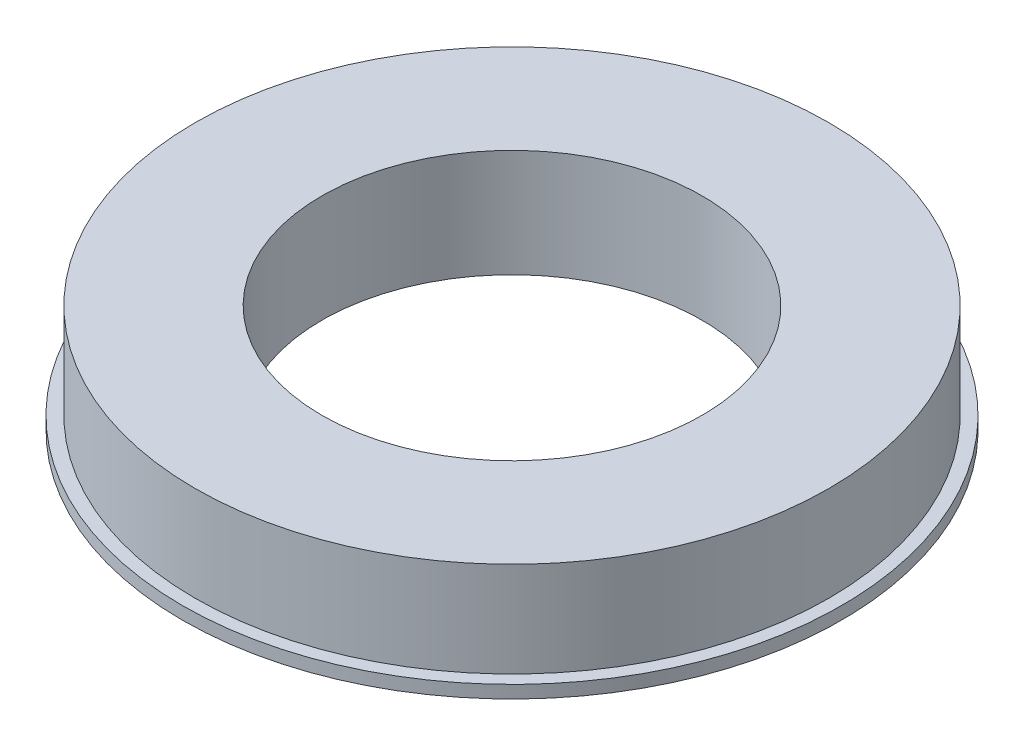
ISO-10303-21;
HEADER;
FILE_DESCRIPTION(('STEP AP214'),'2;1');
FILE_NAME('part.step','',(''),(''),'','','');
FILE_SCHEMA(('AUTOMOTIVE_DESIGN { 1 0 10303 214 1 1 1 1 }'));
ENDSEC;
DATA;
#1=APPLICATION_CONTEXT('core data for automotive mechanical design processes');
#2=APPLICATION_PROTOCOL_DEFINITION('international standard','automotive_design',2000,#1);
#3=PRODUCT_CONTEXT('',#1,'mechanical');
#4=PRODUCT('Part','Part','',(#3));
#5=PRODUCT_RELATED_PRODUCT_CATEGORY('part','',(#4));
#6=PRODUCT_DEFINITION_FORMATION('','',#4);
#7=PRODUCT_DEFINITION_CONTEXT('part definition',#1,'design');
#8=PRODUCT_DEFINITION('design','',#6,#7);
#9=PRODUCT_DEFINITION_SHAPE('','',#8);
#10=(LENGTH_UNIT() NAMED_UNIT(*) SI_UNIT(.MILLI.,.METRE.));
#11=(NAMED_UNIT(*) PLANE_ANGLE_UNIT() SI_UNIT($,.RADIAN.));
#12=(NAMED_UNIT(*) SI_UNIT($,.STERADIAN.) SOLID_ANGLE_UNIT());
#13=UNCERTAINTY_MEASURE_WITH_UNIT(LENGTH_MEASURE(1.E-05),#10,'distance_accuracy_value','');
#14=(GEOMETRIC_REPRESENTATION_CONTEXT(3) GLOBAL_UNCERTAINTY_ASSIGNED_CONTEXT((#13)) GLOBAL_UNIT_ASSIGNED_CONTEXT((#10,
#11,#12)) REPRESENTATION_CONTEXT('',''));
#15=CARTESIAN_POINT('',(0.,0.,0.));
#16=DIRECTION('',(0.,0.,1.));
#17=DIRECTION('',(1.,0.,0.));
#18=AXIS2_PLACEMENT_3D('',#15,#16,#17);
#19=CARTESIAN_POINT('',(0.,2.54,0.));
#20=DIRECTION('',(0.,-1.,0.));
#21=DIRECTION('',(0.,0.,-1.));
#22=AXIS2_PLACEMENT_3D('',#19,#20,#21);
#23=CYLINDRICAL_SURFACE('',#22,66.04);
#24=CARTESIAN_POINT('',(0.,2.54,0.));
#25=DIRECTION('',(0.,1.,0.));
#26=DIRECTION('',(0.,0.,1.));
#27=AXIS2_PLACEMENT_3D('',#24,#25,#26);
#28=CIRCLE('',#27,66.04);
#29=CARTESIAN_POINT('',(0.,2.54,66.04));
#30=VERTEX_POINT('',#29);
#31=EDGE_CURVE('E41',#30,#30,#28,.T.);
#32=ORIENTED_EDGE('',*,*,#31,.F.);
#33=EDGE_LOOP('',(#32));
#34=FACE_BOUND('',#33,.T.);
#35=CARTESIAN_POINT('',(0.,0.,0.));
#36=DIRECTION('',(0.,1.,0.));
#37=DIRECTION('',(0.,0.,1.));
#38=AXIS2_PLACEMENT_3D('',#35,#36,#37);
#39=CIRCLE('',#38,66.04);
#40=CARTESIAN_POINT('',(0.,0.,66.04));
#41=VERTEX_POINT('',#40);
#42=EDGE_CURVE('E37',#41,#41,#39,.T.);
#43=ORIENTED_EDGE('',*,*,#42,.T.);
#44=EDGE_LOOP('',(#43));
#45=FACE_BOUND('',#44,.T.);
#46=ADVANCED_FACE('F34',(#34,#45),#23,.T.);
#47=CARTESIAN_POINT('',(0.,2.54,0.));
#48=DIRECTION('',(0.,1.,0.));
#49=DIRECTION('',(0.,0.,1.));
#50=AXIS2_PLACEMENT_3D('',#47,#48,#49);
#51=PLANE('',#50);
#52=CARTESIAN_POINT('',(0.,2.54,0.));
#53=DIRECTION('',(0.,1.,0.));
#54=DIRECTION('',(0.,0.,1.));
#55=AXIS2_PLACEMENT_3D('',#52,#53,#54);
#56=CIRCLE('',#55,63.5);
#57=CARTESIAN_POINT('',(0.,2.54,-63.5));
#58=VERTEX_POINT('',#57);
#59=EDGE_CURVE('E10',#58,#58,#56,.T.);
#60=ORIENTED_EDGE('',*,*,#59,.F.);
#61=EDGE_LOOP('',(#60));
#62=FACE_BOUND('',#61,.T.);
#63=ORIENTED_EDGE('',*,*,#31,.T.);
#64=EDGE_LOOP('',(#63));
#65=FACE_BOUND('',#64,.T.);
#66=ADVANCED_FACE('F78',(#62,#65),#51,.T.);
#67=CARTESIAN_POINT('',(0.,0.,0.));
#68=DIRECTION('',(0.,1.,0.));
#69=DIRECTION('',(0.,0.,1.));
#70=AXIS2_PLACEMENT_3D('',#67,#68,#69);
#71=PLANE('',#70);
#72=CARTESIAN_POINT('',(0.,0.,0.));
#73=DIRECTION('',(0.,1.,0.));
#74=DIRECTION('',(0.,0.,1.));
#75=AXIS2_PLACEMENT_3D('',#72,#73,#74);
#76=CIRCLE('',#75,38.1);
#77=CARTESIAN_POINT('',(0.,0.,38.1));
#78=VERTEX_POINT('',#77);
#79=EDGE_CURVE('E50',#78,#78,#76,.T.);
#80=ORIENTED_EDGE('',*,*,#79,.T.);
#81=EDGE_LOOP('',(#80));
#82=FACE_BOUND('',#81,.T.);
#83=ORIENTED_EDGE('',*,*,#42,.F.);
#84=EDGE_LOOP('',(#83));
#85=FACE_BOUND('',#84,.T.);
#86=ADVANCED_FACE('F57',(#82,#85),#71,.F.);
#87=CARTESIAN_POINT('',(0.,21.59,0.));
#88=DIRECTION('',(0.,-1.,0.));
#89=DIRECTION('',(0.,0.,-1.));
#90=AXIS2_PLACEMENT_3D('',#87,#88,#89);
#91=CYLINDRICAL_SURFACE('',#90,63.5);
#92=CARTESIAN_POINT('',(0.,21.59,0.));
#93=DIRECTION('',(0.,1.,0.));
#94=DIRECTION('',(0.,0.,1.));
#95=AXIS2_PLACEMENT_3D('',#92,#93,#94);
#96=CIRCLE('',#95,63.5);
#97=CARTESIAN_POINT('',(0.,21.59,-63.5));
#98=VERTEX_POINT('',#97);
#99=EDGE_CURVE('E47',#98,#98,#96,.T.);
#100=CARTESIAN_POINT('',(0.,21.59,-63.5));
#101=CARTESIAN_POINT('',(0.,21.3915625,-63.5));
#102=CARTESIAN_POINT('',(0.,21.193125,-63.5));
#103=CARTESIAN_POINT('',(0.,20.79625,-63.5));
#104=CARTESIAN_POINT('',(0.,20.5978125,-63.5));
#105=CARTESIAN_POINT('',(0.,20.2009375,-63.5));
#106=CARTESIAN_POINT('',(0.,20.0025,-63.5));
#107=CARTESIAN_POINT('',(0.,19.605625,-63.5));
#108=CARTESIAN_POINT('',(0.,19.4071875,-63.5));
#109=CARTESIAN_POINT('',(0.,19.0103125,-63.5));
#110=CARTESIAN_POINT('',(0.,18.811875,-63.5));
#111=CARTESIAN_POINT('',(0.,18.415,-63.5));
#112=CARTESIAN_POINT('',(0.,18.2165625,-63.5));
#113=CARTESIAN_POINT('',(0.,17.8196875,-63.5));
#114=CARTESIAN_POINT('',(0.,17.62125,-63.5));
#115=CARTESIAN_POINT('',(0.,17.224375,-63.5));
#116=CARTESIAN_POINT('',(0.,17.0259375,-63.5));
#117=CARTESIAN_POINT('',(0.,16.6290625,-63.5));
#118=CARTESIAN_POINT('',(0.,16.430625,-63.5));
#119=CARTESIAN_POINT('',(0.,16.03375,-63.5));
#120=CARTESIAN_POINT('',(0.,15.8353125,-63.5));
#121=CARTESIAN_POINT('',(0.,15.4384375,-63.5));
#122=CARTESIAN_POINT('',(0.,15.24,-63.5));
#123=CARTESIAN_POINT('',(0.,14.843125,-63.5));
#124=CARTESIAN_POINT('',(0.,14.6446875,-63.5));
#125=CARTESIAN_POINT('',(0.,14.2478125,-63.5));
#126=CARTESIAN_POINT('',(0.,14.049375,-63.5));
#127=CARTESIAN_POINT('',(0.,13.6525,-63.5));
#128=CARTESIAN_POINT('',(0.,13.4540625,-63.5));
#129=CARTESIAN_POINT('',(0.,13.0571875,-63.5));
#130=CARTESIAN_POINT('',(0.,12.85875,-63.5));
#131=CARTESIAN_POINT('',(0.,12.461875,-63.5));
#132=CARTESIAN_POINT('',(0.,12.2634375,-63.5));
#133=CARTESIAN_POINT('',(0.,11.8665625,-63.5));
#134=CARTESIAN_POINT('',(0.,11.668125,-63.5));
#135=CARTESIAN_POINT('',(0.,11.27125,-63.5));
#136=CARTESIAN_POINT('',(0.,11.0728125,-63.5));
#137=CARTESIAN_POINT('',(0.,10.6759375,-63.5));
#138=CARTESIAN_POINT('',(0.,10.4775,-63.5));
#139=CARTESIAN_POINT('',(0.,10.080625,-63.5));
#140=CARTESIAN_POINT('',(0.,9.8821875,-63.5));
#141=CARTESIAN_POINT('',(0.,9.4853125,-63.5));
#142=CARTESIAN_POINT('',(0.,9.286875,-63.5));
#143=CARTESIAN_POINT('',(0.,8.89,-63.5));
#144=CARTESIAN_POINT('',(0.,8.6915625,-63.5));
#145=CARTESIAN_POINT('',(0.,8.2946875,-63.5));
#146=CARTESIAN_POINT('',(0.,8.09625,-63.5));
#147=CARTESIAN_POINT('',(0.,7.699375,-63.5));
#148=CARTESIAN_POINT('',(0.,7.5009375,-63.5));
#149=CARTESIAN_POINT('',(0.,7.1040625,-63.5));
#150=CARTESIAN_POINT('',(0.,6.905625,-63.5));
#151=CARTESIAN_POINT('',(0.,6.50875,-63.5));
#152=CARTESIAN_POINT('',(0.,6.3103125,-63.5));
#153=CARTESIAN_POINT('',(0.,5.9134375,-63.5));
#154=CARTESIAN_POINT('',(0.,5.715,-63.5));
#155=CARTESIAN_POINT('',(0.,5.318125,-63.5));
#156=CARTESIAN_POINT('',(0.,5.1196875,-63.5));
#157=CARTESIAN_POINT('',(0.,4.7228125,-63.5));
#158=CARTESIAN_POINT('',(0.,4.524375,-63.5));
#159=CARTESIAN_POINT('',(0.,4.1275,-63.5));
#160=CARTESIAN_POINT('',(0.,3.9290625,-63.5));
#161=CARTESIAN_POINT('',(0.,3.5321875,-63.5));
#162=CARTESIAN_POINT('',(0.,3.33375,-63.5));
#163=CARTESIAN_POINT('',(0.,2.936875,-63.5));
#164=CARTESIAN_POINT('',(0.,2.7384375,-63.5));
#165=CARTESIAN_POINT('',(0.,2.54,-63.5));
#166=B_SPLINE_CURVE_WITH_KNOTS('',3,(#100,#101,#102,#103,#104,#105,#106,#107,#108,#109,#110,
#111,#112,#113,#114,#115,#116,#117,#118,#119,#120,#121,#122,#123,#124,#125,#126,#127,#128,#129,
#130,#131,#132,#133,#134,#135,#136,#137,#138,#139,#140,#141,#142,#143,#144,#145,#146,#147,#148,
#149,#150,#151,#152,#153,#154,#155,#156,#157,#158,#159,#160,#161,#162,#163,#164,#165),
.UNSPECIFIED.,.F.,.F.,(4,2,2,2,2,2,2,2,2,2,2,2,2,2,2,2,2,2,2,2,2,2,2,2,2,2,2,2,2,2,2,2,4),(0.,
0.5953125,1.190625,1.7859375,2.38125,2.9765625,3.571875,4.1671875,4.7625,5.3578125,5.953125,
6.5484375,7.14375,7.7390625,8.334375,8.9296875,9.525,10.1203125,10.715625,11.3109375,11.90625,
12.5015625,13.096875,13.6921875,14.2875,14.8828125,15.478125,16.0734375,16.66875,17.2640625,
17.859375,18.4546875,19.05),.UNSPECIFIED.);
#167=EDGE_CURVE('BSEAM69',#98,#58,#166,.T.);
#168=ORIENTED_EDGE('',*,*,#99,.F.);
#169=ORIENTED_EDGE('',*,*,#59,.T.);
#170=ORIENTED_EDGE('',*,*,#167,.T.);
#171=ORIENTED_EDGE('',*,*,#167,.F.);
#172=EDGE_LOOP('',(#168,#170,#169,#171));
#173=FACE_BOUND('',#172,.T.);
#174=ADVANCED_FACE('F69',(#173),#91,.T.);
#175=CARTESIAN_POINT('',(0.,21.59,0.));
#176=DIRECTION('',(0.,1.,0.));
#177=DIRECTION('',(0.,0.,1.));
#178=AXIS2_PLACEMENT_3D('',#175,#176,#177);
#179=PLANE('',#178);
#180=CARTESIAN_POINT('',(0.,21.59,0.));
#181=DIRECTION('',(0.,1.,0.));
#182=DIRECTION('',(0.,0.,1.));
#183=AXIS2_PLACEMENT_3D('',#180,#181,#182);
#184=CIRCLE('',#183,38.1);
#185=CARTESIAN_POINT('',(0.,21.59,38.1));
#186=VERTEX_POINT('',#185);
#187=EDGE_CURVE('E51',#186,#186,#184,.T.);
#188=ORIENTED_EDGE('',*,*,#187,.F.);
#189=EDGE_LOOP('',(#188));
#190=FACE_BOUND('',#189,.T.);
#191=ORIENTED_EDGE('',*,*,#99,.T.);
#192=EDGE_LOOP('',(#191));
#193=FACE_BOUND('',#192,.T.);
#194=ADVANCED_FACE('F63',(#190,#193),#179,.T.);
#195=CARTESIAN_POINT('',(0.,0.,0.));
#196=DIRECTION('',(0.,1.,0.));
#197=DIRECTION('',(0.,0.,1.));
#198=AXIS2_PLACEMENT_3D('',#195,#196,#197);
#199=CYLINDRICAL_SURFACE('',#198,38.1);
#200=ORIENTED_EDGE('',*,*,#79,.F.);
#201=EDGE_LOOP('',(#200));
#202=FACE_BOUND('',#201,.T.);
#203=ORIENTED_EDGE('',*,*,#187,.T.);
#204=EDGE_LOOP('',(#203));
#205=FACE_BOUND('',#204,.T.);
#206=ADVANCED_FACE('F60',(#202,#205),#199,.F.);
#207=CLOSED_SHELL('',(#46,#66,#86,#174,#194,#206));
#208=MANIFOLD_SOLID_BREP('B2',#207);
#209=ADVANCED_BREP_SHAPE_REPRESENTATION('',(#18,#208),#14);
#210=SHAPE_DEFINITION_REPRESENTATION(#9,#209);
ENDSEC;
END-ISO-10303-21;
